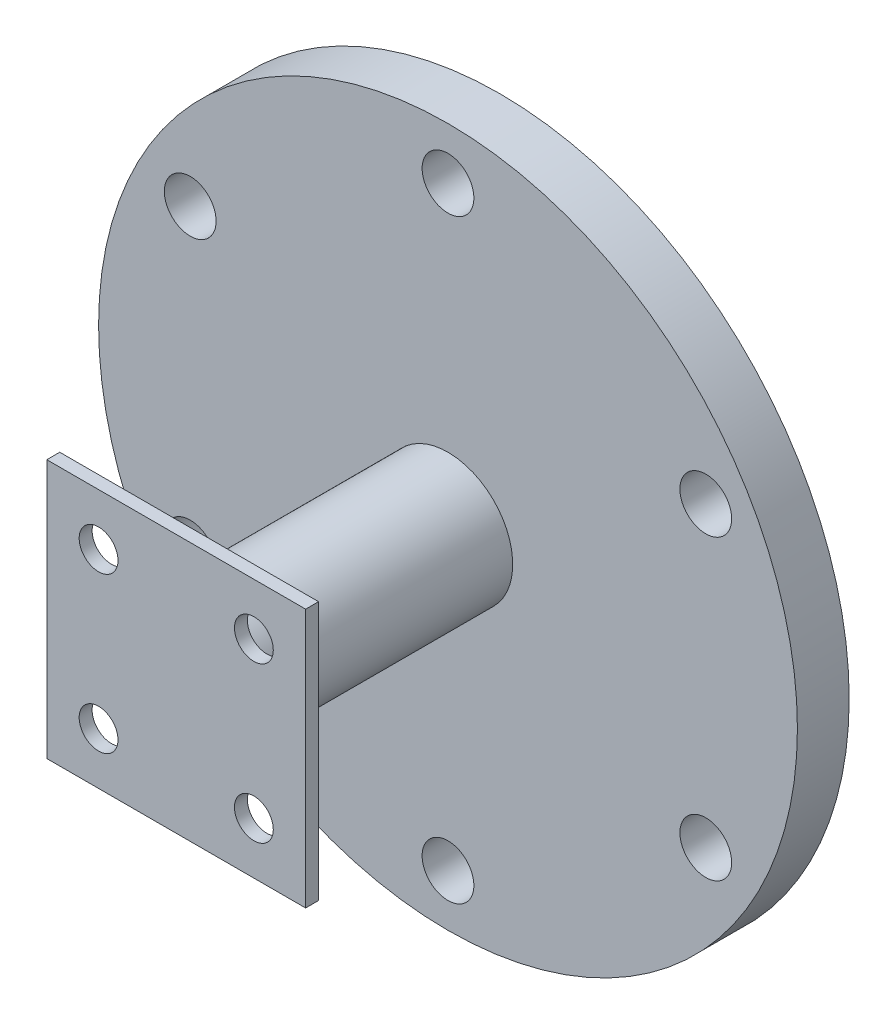
ISO-10303-21;
HEADER;
FILE_DESCRIPTION(('STEP AP214'),'2;1');
FILE_NAME('part.step','',(''),(''),'','','');
FILE_SCHEMA(('AUTOMOTIVE_DESIGN { 1 0 10303 214 1 1 1 1 }'));
ENDSEC;
DATA;
#1=APPLICATION_CONTEXT('core data for automotive mechanical design processes');
#2=APPLICATION_PROTOCOL_DEFINITION('international standard','automotive_design',2000,#1);
#3=PRODUCT_CONTEXT('',#1,'mechanical');
#4=PRODUCT('Part','Part','',(#3));
#5=PRODUCT_RELATED_PRODUCT_CATEGORY('part','',(#4));
#6=PRODUCT_DEFINITION_FORMATION('','',#4);
#7=PRODUCT_DEFINITION_CONTEXT('part definition',#1,'design');
#8=PRODUCT_DEFINITION('design','',#6,#7);
#9=PRODUCT_DEFINITION_SHAPE('','',#8);
#10=(LENGTH_UNIT() NAMED_UNIT(*) SI_UNIT(.MILLI.,.METRE.));
#11=(NAMED_UNIT(*) PLANE_ANGLE_UNIT() SI_UNIT($,.RADIAN.));
#12=(NAMED_UNIT(*) SI_UNIT($,.STERADIAN.) SOLID_ANGLE_UNIT());
#13=UNCERTAINTY_MEASURE_WITH_UNIT(LENGTH_MEASURE(1.E-05),#10,'distance_accuracy_value','');
#14=(GEOMETRIC_REPRESENTATION_CONTEXT(3) GLOBAL_UNCERTAINTY_ASSIGNED_CONTEXT((#13)) GLOBAL_UNIT_ASSIGNED_CONTEXT((#10,
#11,#12)) REPRESENTATION_CONTEXT('',''));
#15=CARTESIAN_POINT('',(0.,0.,0.));
#16=DIRECTION('',(0.,0.,1.));
#17=DIRECTION('',(1.,0.,0.));
#18=AXIS2_PLACEMENT_3D('',#15,#16,#17);
#19=CARTESIAN_POINT('',(0.,0.,0.));
#20=DIRECTION('',(0.,0.,1.));
#21=DIRECTION('',(1.,0.,0.));
#22=AXIS2_PLACEMENT_3D('',#19,#20,#21);
#23=PLANE('',#22);
#24=CARTESIAN_POINT('',(0.,23.,0.));
#25=DIRECTION('',(0.,0.,-1.));
#26=DIRECTION('',(-1.,0.,0.));
#27=AXIS2_PLACEMENT_3D('',#24,#25,#26);
#28=CIRCLE('',#27,2.);
#29=CARTESIAN_POINT('',(2.,23.,0.));
#30=VERTEX_POINT('',#29);
#31=EDGE_CURVE('E282',#30,#30,#28,.T.);
#32=ORIENTED_EDGE('',*,*,#31,.F.);
#33=EDGE_LOOP('',(#32));
#34=FACE_BOUND('',#33,.T.);
#35=CARTESIAN_POINT('',(-19.9185842870421,11.5,0.));
#36=DIRECTION('',(0.,0.,-1.));
#37=DIRECTION('',(-1.,0.,0.));
#38=AXIS2_PLACEMENT_3D('',#35,#36,#37);
#39=CIRCLE('',#38,2.);
#40=CARTESIAN_POINT('',(-17.9185842870421,11.5,0.));
#41=VERTEX_POINT('',#40);
#42=EDGE_CURVE('E223',#41,#41,#39,.T.);
#43=ORIENTED_EDGE('',*,*,#42,.F.);
#44=EDGE_LOOP('',(#43));
#45=FACE_BOUND('',#44,.T.);
#46=CARTESIAN_POINT('',(-19.9185842870421,-11.5,0.));
#47=DIRECTION('',(0.,0.,-1.));
#48=DIRECTION('',(-1.,0.,0.));
#49=AXIS2_PLACEMENT_3D('',#46,#47,#48);
#50=CIRCLE('',#49,2.);
#51=CARTESIAN_POINT('',(-17.9185842870421,-11.5,0.));
#52=VERTEX_POINT('',#51);
#53=EDGE_CURVE('E142',#52,#52,#50,.T.);
#54=ORIENTED_EDGE('',*,*,#53,.F.);
#55=EDGE_LOOP('',(#54));
#56=FACE_BOUND('',#55,.T.);
#57=CARTESIAN_POINT('',(0.,-23.,0.));
#58=DIRECTION('',(0.,0.,-1.));
#59=DIRECTION('',(-1.,0.,0.));
#60=AXIS2_PLACEMENT_3D('',#57,#58,#59);
#61=CIRCLE('',#60,2.);
#62=CARTESIAN_POINT('',(2.,-23.,0.));
#63=VERTEX_POINT('',#62);
#64=EDGE_CURVE('E154',#63,#63,#61,.T.);
#65=ORIENTED_EDGE('',*,*,#64,.F.);
#66=EDGE_LOOP('',(#65));
#67=FACE_BOUND('',#66,.T.);
#68=CARTESIAN_POINT('',(19.9185842870421,-11.5,0.));
#69=DIRECTION('',(0.,0.,-1.));
#70=DIRECTION('',(-1.,0.,0.));
#71=AXIS2_PLACEMENT_3D('',#68,#69,#70);
#72=CIRCLE('',#71,2.);
#73=CARTESIAN_POINT('',(21.9185842870421,-11.5,0.));
#74=VERTEX_POINT('',#73);
#75=EDGE_CURVE('E241',#74,#74,#72,.T.);
#76=ORIENTED_EDGE('',*,*,#75,.F.);
#77=EDGE_LOOP('',(#76));
#78=FACE_BOUND('',#77,.T.);
#79=CARTESIAN_POINT('',(19.9185842870421,11.5,0.));
#80=DIRECTION('',(0.,0.,-1.));
#81=DIRECTION('',(-1.,0.,0.));
#82=AXIS2_PLACEMENT_3D('',#79,#80,#81);
#83=CIRCLE('',#82,2.);
#84=CARTESIAN_POINT('',(21.9185842870421,11.5,0.));
#85=VERTEX_POINT('',#84);
#86=EDGE_CURVE('E172',#85,#85,#83,.T.);
#87=ORIENTED_EDGE('',*,*,#86,.F.);
#88=EDGE_LOOP('',(#87));
#89=FACE_BOUND('',#88,.T.);
#90=CARTESIAN_POINT('',(0.,0.,0.));
#91=DIRECTION('',(0.,0.,1.));
#92=DIRECTION('',(1.,0.,0.));
#93=AXIS2_PLACEMENT_3D('',#90,#91,#92);
#94=CIRCLE('',#93,27.);
#95=CARTESIAN_POINT('',(-27.,0.,0.));
#96=VERTEX_POINT('',#95);
#97=EDGE_CURVE('E11',#96,#96,#94,.T.);
#98=ORIENTED_EDGE('',*,*,#97,.F.);
#99=EDGE_LOOP('',(#98));
#100=FACE_BOUND('',#99,.T.);
#101=ADVANCED_FACE('F16',(#34,#45,#56,#67,#78,#89,#100),#23,.F.);
#102=CARTESIAN_POINT('',(0.,0.,4.));
#103=DIRECTION('',(0.,0.,1.));
#104=DIRECTION('',(1.,0.,0.));
#105=AXIS2_PLACEMENT_3D('',#102,#103,#104);
#106=PLANE('',#105);
#107=CARTESIAN_POINT('',(0.,23.,4.));
#108=DIRECTION('',(0.,0.,-1.));
#109=DIRECTION('',(-1.,0.,0.));
#110=AXIS2_PLACEMENT_3D('',#107,#108,#109);
#111=CIRCLE('',#110,2.);
#112=CARTESIAN_POINT('',(2.,23.,4.));
#113=VERTEX_POINT('',#112);
#114=EDGE_CURVE('E212',#113,#113,#111,.T.);
#115=ORIENTED_EDGE('',*,*,#114,.T.);
#116=EDGE_LOOP('',(#115));
#117=FACE_BOUND('',#116,.T.);
#118=CARTESIAN_POINT('',(-19.9185842870421,11.5,4.));
#119=DIRECTION('',(0.,0.,-1.));
#120=DIRECTION('',(-1.,0.,0.));
#121=AXIS2_PLACEMENT_3D('',#118,#119,#120);
#122=CIRCLE('',#121,2.);
#123=CARTESIAN_POINT('',(-17.9185842870421,11.5,4.));
#124=VERTEX_POINT('',#123);
#125=EDGE_CURVE('E20',#124,#124,#122,.T.);
#126=ORIENTED_EDGE('',*,*,#125,.T.);
#127=EDGE_LOOP('',(#126));
#128=FACE_BOUND('',#127,.T.);
#129=CARTESIAN_POINT('',(-19.9185842870421,-11.5,4.));
#130=DIRECTION('',(0.,0.,-1.));
#131=DIRECTION('',(-1.,0.,0.));
#132=AXIS2_PLACEMENT_3D('',#129,#130,#131);
#133=CIRCLE('',#132,2.);
#134=CARTESIAN_POINT('',(-17.9185842870421,-11.5,4.));
#135=VERTEX_POINT('',#134);
#136=EDGE_CURVE('E264',#135,#135,#133,.T.);
#137=ORIENTED_EDGE('',*,*,#136,.T.);
#138=EDGE_LOOP('',(#137));
#139=FACE_BOUND('',#138,.T.);
#140=CARTESIAN_POINT('',(0.,-23.,4.));
#141=DIRECTION('',(0.,0.,-1.));
#142=DIRECTION('',(-1.,0.,0.));
#143=AXIS2_PLACEMENT_3D('',#140,#141,#142);
#144=CIRCLE('',#143,2.);
#145=CARTESIAN_POINT('',(2.,-23.,4.));
#146=VERTEX_POINT('',#145);
#147=EDGE_CURVE('E152',#146,#146,#144,.T.);
#148=ORIENTED_EDGE('',*,*,#147,.T.);
#149=EDGE_LOOP('',(#148));
#150=FACE_BOUND('',#149,.T.);
#151=CARTESIAN_POINT('',(19.9185842870421,-11.5,4.));
#152=DIRECTION('',(0.,0.,-1.));
#153=DIRECTION('',(-1.,0.,0.));
#154=AXIS2_PLACEMENT_3D('',#151,#152,#153);
#155=CIRCLE('',#154,2.);
#156=CARTESIAN_POINT('',(21.9185842870421,-11.5,4.));
#157=VERTEX_POINT('',#156);
#158=EDGE_CURVE('E177',#157,#157,#155,.T.);
#159=ORIENTED_EDGE('',*,*,#158,.T.);
#160=EDGE_LOOP('',(#159));
#161=FACE_BOUND('',#160,.T.);
#162=CARTESIAN_POINT('',(19.9185842870421,11.5,4.));
#163=DIRECTION('',(0.,0.,-1.));
#164=DIRECTION('',(-1.,0.,0.));
#165=AXIS2_PLACEMENT_3D('',#162,#163,#164);
#166=CIRCLE('',#165,2.);
#167=CARTESIAN_POINT('',(21.9185842870421,11.5,4.));
#168=VERTEX_POINT('',#167);
#169=EDGE_CURVE('E227',#168,#168,#166,.T.);
#170=ORIENTED_EDGE('',*,*,#169,.T.);
#171=EDGE_LOOP('',(#170));
#172=FACE_BOUND('',#171,.T.);
#173=CARTESIAN_POINT('',(0.,0.,4.));
#174=DIRECTION('',(0.,0.,-1.));
#175=DIRECTION('',(1.,0.,0.));
#176=AXIS2_PLACEMENT_3D('',#173,#174,#175);
#177=CIRCLE('',#176,5.);
#178=CARTESIAN_POINT('',(-5.,0.,4.));
#179=VERTEX_POINT('',#178);
#180=EDGE_CURVE('E210',#179,#179,#177,.T.);
#181=ORIENTED_EDGE('',*,*,#180,.T.);
#182=EDGE_LOOP('',(#181));
#183=FACE_BOUND('',#182,.T.);
#184=CARTESIAN_POINT('',(0.,0.,4.));
#185=DIRECTION('',(0.,0.,1.));
#186=DIRECTION('',(1.,0.,0.));
#187=AXIS2_PLACEMENT_3D('',#184,#185,#186);
#188=CIRCLE('',#187,27.);
#189=CARTESIAN_POINT('',(-27.,0.,4.));
#190=VERTEX_POINT('',#189);
#191=EDGE_CURVE('E175',#190,#190,#188,.T.);
#192=ORIENTED_EDGE('',*,*,#191,.T.);
#193=EDGE_LOOP('',(#192));
#194=FACE_BOUND('',#193,.T.);
#195=ADVANCED_FACE('F158',(#117,#128,#139,#150,#161,#172,#183,#194),#106,.T.);
#196=CARTESIAN_POINT('',(0.,0.,0.));
#197=DIRECTION('',(0.,0.,1.));
#198=DIRECTION('',(1.,0.,0.));
#199=AXIS2_PLACEMENT_3D('',#196,#197,#198);
#200=CYLINDRICAL_SURFACE('',#199,27.);
#201=ORIENTED_EDGE('',*,*,#191,.F.);
#202=DIRECTION('',(0.,0.,-1.));
#203=VECTOR('',#202,1.);
#204=CARTESIAN_POINT('',(-27.,0.,0.));
#205=LINE('',#204,#203);
#206=EDGE_CURVE('E27',#190,#96,#205,.T.);
#207=ORIENTED_EDGE('',*,*,#206,.T.);
#208=ORIENTED_EDGE('',*,*,#97,.T.);
#209=ORIENTED_EDGE('',*,*,#206,.F.);
#210=EDGE_LOOP('',(#201,#207,#208,#209));
#211=FACE_BOUND('',#210,.T.);
#212=ADVANCED_FACE('F463',(#211),#200,.T.);
#213=CARTESIAN_POINT('',(19.9185842870421,11.5,0.));
#214=DIRECTION('',(0.,0.,1.));
#215=DIRECTION('',(-1.,0.,0.));
#216=AXIS2_PLACEMENT_3D('',#213,#214,#215);
#217=CYLINDRICAL_SURFACE('',#216,2.);
#218=ORIENTED_EDGE('',*,*,#169,.F.);
#219=DIRECTION('',(0.,0.,-1.));
#220=VECTOR('',#219,1.);
#221=CARTESIAN_POINT('',(21.9185842870421,11.5,0.));
#222=LINE('',#221,#220);
#223=EDGE_CURVE('E176',#168,#85,#222,.T.);
#224=ORIENTED_EDGE('',*,*,#223,.T.);
#225=ORIENTED_EDGE('',*,*,#86,.T.);
#226=ORIENTED_EDGE('',*,*,#223,.F.);
#227=EDGE_LOOP('',(#218,#224,#225,#226));
#228=FACE_BOUND('',#227,.T.);
#229=ADVANCED_FACE('F379',(#228),#217,.F.);
#230=CARTESIAN_POINT('',(19.9185842870421,-11.5,0.));
#231=DIRECTION('',(0.,0.,1.));
#232=DIRECTION('',(-1.,0.,0.));
#233=AXIS2_PLACEMENT_3D('',#230,#231,#232);
#234=CYLINDRICAL_SURFACE('',#233,2.);
#235=ORIENTED_EDGE('',*,*,#158,.F.);
#236=DIRECTION('',(0.,0.,-1.));
#237=VECTOR('',#236,1.);
#238=CARTESIAN_POINT('',(21.9185842870421,-11.5,0.));
#239=LINE('',#238,#237);
#240=EDGE_CURVE('E181',#157,#74,#239,.T.);
#241=ORIENTED_EDGE('',*,*,#240,.T.);
#242=ORIENTED_EDGE('',*,*,#75,.T.);
#243=ORIENTED_EDGE('',*,*,#240,.F.);
#244=EDGE_LOOP('',(#235,#241,#242,#243));
#245=FACE_BOUND('',#244,.T.);
#246=ADVANCED_FACE('F370',(#245),#234,.F.);
#247=CARTESIAN_POINT('',(0.,-23.,0.));
#248=DIRECTION('',(0.,0.,1.));
#249=DIRECTION('',(-1.,0.,0.));
#250=AXIS2_PLACEMENT_3D('',#247,#248,#249);
#251=CYLINDRICAL_SURFACE('',#250,2.);
#252=ORIENTED_EDGE('',*,*,#147,.F.);
#253=DIRECTION('',(0.,0.,-1.));
#254=VECTOR('',#253,1.);
#255=CARTESIAN_POINT('',(2.,-23.,0.));
#256=LINE('',#255,#254);
#257=EDGE_CURVE('E149',#146,#63,#256,.T.);
#258=ORIENTED_EDGE('',*,*,#257,.T.);
#259=ORIENTED_EDGE('',*,*,#64,.T.);
#260=ORIENTED_EDGE('',*,*,#257,.F.);
#261=EDGE_LOOP('',(#252,#258,#259,#260));
#262=FACE_BOUND('',#261,.T.);
#263=ADVANCED_FACE('F151',(#262),#251,.F.);
#264=CARTESIAN_POINT('',(-19.9185842870421,-11.5,0.));
#265=DIRECTION('',(0.,0.,1.));
#266=DIRECTION('',(-1.,0.,0.));
#267=AXIS2_PLACEMENT_3D('',#264,#265,#266);
#268=CYLINDRICAL_SURFACE('',#267,2.);
#269=ORIENTED_EDGE('',*,*,#136,.F.);
#270=DIRECTION('',(0.,0.,-1.));
#271=VECTOR('',#270,1.);
#272=CARTESIAN_POINT('',(-17.9185842870421,-11.5,0.));
#273=LINE('',#272,#271);
#274=EDGE_CURVE('E166',#135,#52,#273,.T.);
#275=ORIENTED_EDGE('',*,*,#274,.T.);
#276=ORIENTED_EDGE('',*,*,#53,.T.);
#277=ORIENTED_EDGE('',*,*,#274,.F.);
#278=EDGE_LOOP('',(#269,#275,#276,#277));
#279=FACE_BOUND('',#278,.T.);
#280=ADVANCED_FACE('F369',(#279),#268,.F.);
#281=CARTESIAN_POINT('',(-19.9185842870421,11.5,0.));
#282=DIRECTION('',(0.,0.,1.));
#283=DIRECTION('',(-1.,0.,0.));
#284=AXIS2_PLACEMENT_3D('',#281,#282,#283);
#285=CYLINDRICAL_SURFACE('',#284,2.);
#286=ORIENTED_EDGE('',*,*,#125,.F.);
#287=DIRECTION('',(0.,0.,-1.));
#288=VECTOR('',#287,1.);
#289=CARTESIAN_POINT('',(-17.9185842870421,11.5,0.));
#290=LINE('',#289,#288);
#291=EDGE_CURVE('E219',#124,#41,#290,.T.);
#292=ORIENTED_EDGE('',*,*,#291,.T.);
#293=ORIENTED_EDGE('',*,*,#42,.T.);
#294=ORIENTED_EDGE('',*,*,#291,.F.);
#295=EDGE_LOOP('',(#286,#292,#293,#294));
#296=FACE_BOUND('',#295,.T.);
#297=ADVANCED_FACE('F422',(#296),#285,.F.);
#298=CARTESIAN_POINT('',(0.,23.,0.));
#299=DIRECTION('',(0.,0.,1.));
#300=DIRECTION('',(-1.,0.,0.));
#301=AXIS2_PLACEMENT_3D('',#298,#299,#300);
#302=CYLINDRICAL_SURFACE('',#301,2.);
#303=ORIENTED_EDGE('',*,*,#114,.F.);
#304=DIRECTION('',(0.,0.,-1.));
#305=VECTOR('',#304,1.);
#306=CARTESIAN_POINT('',(2.,23.,0.));
#307=LINE('',#306,#305);
#308=EDGE_CURVE('E216',#113,#30,#307,.T.);
#309=ORIENTED_EDGE('',*,*,#308,.T.);
#310=ORIENTED_EDGE('',*,*,#31,.T.);
#311=ORIENTED_EDGE('',*,*,#308,.F.);
#312=EDGE_LOOP('',(#303,#309,#310,#311));
#313=FACE_BOUND('',#312,.T.);
#314=ADVANCED_FACE('F417',(#313),#302,.F.);
#315=CARTESIAN_POINT('',(0.,0.,4.));
#316=DIRECTION('',(0.,0.,1.));
#317=DIRECTION('',(1.,0.,0.));
#318=AXIS2_PLACEMENT_3D('',#315,#316,#317);
#319=CYLINDRICAL_SURFACE('',#318,5.);
#320=CARTESIAN_POINT('',(0.,0.,24.));
#321=DIRECTION('',(0.,0.,1.));
#322=DIRECTION('',(1.,0.,0.));
#323=AXIS2_PLACEMENT_3D('',#320,#321,#322);
#324=CIRCLE('',#323,5.);
#325=CARTESIAN_POINT('',(-5.,0.,24.));
#326=VERTEX_POINT('',#325);
#327=EDGE_CURVE('E228',#326,#326,#324,.T.);
#328=ORIENTED_EDGE('',*,*,#327,.F.);
#329=DIRECTION('',(0.,0.,-1.));
#330=VECTOR('',#329,1.);
#331=CARTESIAN_POINT('',(-5.,0.,4.));
#332=LINE('',#331,#330);
#333=EDGE_CURVE('E206',#326,#179,#332,.T.);
#334=ORIENTED_EDGE('',*,*,#333,.T.);
#335=ORIENTED_EDGE('',*,*,#180,.F.);
#336=ORIENTED_EDGE('',*,*,#333,.F.);
#337=EDGE_LOOP('',(#328,#334,#335,#336));
#338=FACE_BOUND('',#337,.T.);
#339=ADVANCED_FACE('F319',(#338),#319,.T.);
#340=CARTESIAN_POINT('',(0.,0.,25.));
#341=DIRECTION('',(0.,0.,1.));
#342=DIRECTION('',(1.,0.,0.));
#343=AXIS2_PLACEMENT_3D('',#340,#341,#342);
#344=PLANE('',#343);
#345=CARTESIAN_POINT('',(6.,6.,25.));
#346=DIRECTION('',(0.,0.,-1.));
#347=DIRECTION('',(-1.,0.,0.));
#348=AXIS2_PLACEMENT_3D('',#345,#346,#347);
#349=CIRCLE('',#348,1.5);
#350=CARTESIAN_POINT('',(7.5,6.,25.));
#351=VERTEX_POINT('',#350);
#352=EDGE_CURVE('E232',#351,#351,#349,.T.);
#353=ORIENTED_EDGE('',*,*,#352,.T.);
#354=EDGE_LOOP('',(#353));
#355=FACE_BOUND('',#354,.T.);
#356=CARTESIAN_POINT('',(-6.,6.,25.));
#357=DIRECTION('',(0.,0.,-1.));
#358=DIRECTION('',(-1.,0.,0.));
#359=AXIS2_PLACEMENT_3D('',#356,#357,#358);
#360=CIRCLE('',#359,1.5);
#361=CARTESIAN_POINT('',(-4.5,6.,25.));
#362=VERTEX_POINT('',#361);
#363=EDGE_CURVE('E233',#362,#362,#360,.T.);
#364=ORIENTED_EDGE('',*,*,#363,.T.);
#365=EDGE_LOOP('',(#364));
#366=FACE_BOUND('',#365,.T.);
#367=CARTESIAN_POINT('',(-6.,-6.,25.));
#368=DIRECTION('',(0.,0.,-1.));
#369=DIRECTION('',(-1.,0.,0.));
#370=AXIS2_PLACEMENT_3D('',#367,#368,#369);
#371=CIRCLE('',#370,1.5);
#372=CARTESIAN_POINT('',(-4.5,-6.,25.));
#373=VERTEX_POINT('',#372);
#374=EDGE_CURVE('E187',#373,#373,#371,.T.);
#375=ORIENTED_EDGE('',*,*,#374,.T.);
#376=EDGE_LOOP('',(#375));
#377=FACE_BOUND('',#376,.T.);
#378=CARTESIAN_POINT('',(6.,-6.,25.));
#379=DIRECTION('',(0.,0.,-1.));
#380=DIRECTION('',(-1.,0.,0.));
#381=AXIS2_PLACEMENT_3D('',#378,#379,#380);
#382=CIRCLE('',#381,1.5);
#383=CARTESIAN_POINT('',(7.5,-6.,25.));
#384=VERTEX_POINT('',#383);
#385=EDGE_CURVE('E253',#384,#384,#382,.T.);
#386=ORIENTED_EDGE('',*,*,#385,.T.);
#387=EDGE_LOOP('',(#386));
#388=FACE_BOUND('',#387,.T.);
#389=DIRECTION('',(-1.,0.,0.));
#390=VECTOR('',#389,1.);
#391=CARTESIAN_POINT('',(10.,10.,25.));
#392=LINE('',#391,#390);
#393=CARTESIAN_POINT('',(10.,10.,25.));
#394=VERTEX_POINT('',#393);
#395=CARTESIAN_POINT('',(-10.,10.,25.));
#396=VERTEX_POINT('',#395);
#397=EDGE_CURVE('E211',#394,#396,#392,.T.);
#398=ORIENTED_EDGE('',*,*,#397,.T.);
#399=DIRECTION('',(0.,-1.,0.));
#400=VECTOR('',#399,1.);
#401=CARTESIAN_POINT('',(-10.,10.,25.));
#402=LINE('',#401,#400);
#403=CARTESIAN_POINT('',(-10.,-10.,25.));
#404=VERTEX_POINT('',#403);
#405=EDGE_CURVE('E170',#396,#404,#402,.T.);
#406=ORIENTED_EDGE('',*,*,#405,.T.);
#407=DIRECTION('',(1.,0.,0.));
#408=VECTOR('',#407,1.);
#409=CARTESIAN_POINT('',(-10.,-10.,25.));
#410=LINE('',#409,#408);
#411=CARTESIAN_POINT('',(10.,-10.,25.));
#412=VERTEX_POINT('',#411);
#413=EDGE_CURVE('E182',#404,#412,#410,.T.);
#414=ORIENTED_EDGE('',*,*,#413,.T.);
#415=DIRECTION('',(0.,1.,0.));
#416=VECTOR('',#415,1.);
#417=CARTESIAN_POINT('',(10.,-10.,25.));
#418=LINE('',#417,#416);
#419=EDGE_CURVE('E304',#412,#394,#418,.T.);
#420=ORIENTED_EDGE('',*,*,#419,.T.);
#421=EDGE_LOOP('',(#398,#406,#414,#420));
#422=FACE_BOUND('',#421,.T.);
#423=ADVANCED_FACE('F315',(#355,#366,#377,#388,#422),#344,.T.);
#424=CARTESIAN_POINT('',(10.,10.,24.));
#425=DIRECTION('',(0.,1.,0.));
#426=DIRECTION('',(1.,0.,0.));
#427=AXIS2_PLACEMENT_3D('',#424,#425,#426);
#428=PLANE('',#427);
#429=DIRECTION('',(-1.,0.,0.));
#430=VECTOR('',#429,1.);
#431=CARTESIAN_POINT('',(10.,10.,24.));
#432=LINE('',#431,#430);
#433=CARTESIAN_POINT('',(10.,10.,24.));
#434=VERTEX_POINT('',#433);
#435=CARTESIAN_POINT('',(-10.,10.,24.));
#436=VERTEX_POINT('',#435);
#437=EDGE_CURVE('E193',#434,#436,#432,.T.);
#438=ORIENTED_EDGE('',*,*,#437,.T.);
#439=DIRECTION('',(0.,0.,1.));
#440=VECTOR('',#439,1.);
#441=CARTESIAN_POINT('',(-10.,10.,24.));
#442=LINE('',#441,#440);
#443=EDGE_CURVE('E296',#436,#396,#442,.T.);
#444=ORIENTED_EDGE('',*,*,#443,.T.);
#445=ORIENTED_EDGE('',*,*,#397,.F.);
#446=DIRECTION('',(0.,0.,1.));
#447=VECTOR('',#446,1.);
#448=CARTESIAN_POINT('',(10.,10.,24.));
#449=LINE('',#448,#447);
#450=EDGE_CURVE('E300',#434,#394,#449,.T.);
#451=ORIENTED_EDGE('',*,*,#450,.F.);
#452=EDGE_LOOP('',(#438,#444,#445,#451));
#453=FACE_BOUND('',#452,.T.);
#454=ADVANCED_FACE('F318',(#453),#428,.T.);
#455=CARTESIAN_POINT('',(-10.,10.,24.));
#456=DIRECTION('',(-1.,0.,0.));
#457=DIRECTION('',(0.,1.,0.));
#458=AXIS2_PLACEMENT_3D('',#455,#456,#457);
#459=PLANE('',#458);
#460=DIRECTION('',(0.,-1.,0.));
#461=VECTOR('',#460,1.);
#462=CARTESIAN_POINT('',(-10.,10.,24.));
#463=LINE('',#462,#461);
#464=CARTESIAN_POINT('',(-10.,-10.,24.));
#465=VERTEX_POINT('',#464);
#466=EDGE_CURVE('E248',#436,#465,#463,.T.);
#467=ORIENTED_EDGE('',*,*,#466,.T.);
#468=DIRECTION('',(0.,0.,1.));
#469=VECTOR('',#468,1.);
#470=CARTESIAN_POINT('',(-10.,-10.,24.));
#471=LINE('',#470,#469);
#472=EDGE_CURVE('E185',#465,#404,#471,.T.);
#473=ORIENTED_EDGE('',*,*,#472,.T.);
#474=ORIENTED_EDGE('',*,*,#405,.F.);
#475=ORIENTED_EDGE('',*,*,#443,.F.);
#476=EDGE_LOOP('',(#467,#473,#474,#475));
#477=FACE_BOUND('',#476,.T.);
#478=ADVANCED_FACE('F332',(#477),#459,.T.);
#479=CARTESIAN_POINT('',(-10.,-10.,24.));
#480=DIRECTION('',(0.,-1.,0.));
#481=DIRECTION('',(0.,0.,-1.));
#482=AXIS2_PLACEMENT_3D('',#479,#480,#481);
#483=PLANE('',#482);
#484=DIRECTION('',(1.,0.,0.));
#485=VECTOR('',#484,1.);
#486=CARTESIAN_POINT('',(-10.,-10.,24.));
#487=LINE('',#486,#485);
#488=CARTESIAN_POINT('',(10.,-10.,24.));
#489=VERTEX_POINT('',#488);
#490=EDGE_CURVE('E245',#465,#489,#487,.T.);
#491=ORIENTED_EDGE('',*,*,#490,.T.);
#492=DIRECTION('',(0.,0.,1.));
#493=VECTOR('',#492,1.);
#494=CARTESIAN_POINT('',(10.,-10.,24.));
#495=LINE('',#494,#493);
#496=EDGE_CURVE('E186',#489,#412,#495,.T.);
#497=ORIENTED_EDGE('',*,*,#496,.T.);
#498=ORIENTED_EDGE('',*,*,#413,.F.);
#499=ORIENTED_EDGE('',*,*,#472,.F.);
#500=EDGE_LOOP('',(#491,#497,#498,#499));
#501=FACE_BOUND('',#500,.T.);
#502=ADVANCED_FACE('F402',(#501),#483,.T.);
#503=CARTESIAN_POINT('',(10.,-10.,24.));
#504=DIRECTION('',(1.,0.,0.));
#505=DIRECTION('',(0.,1.,0.));
#506=AXIS2_PLACEMENT_3D('',#503,#504,#505);
#507=PLANE('',#506);
#508=DIRECTION('',(0.,1.,0.));
#509=VECTOR('',#508,1.);
#510=CARTESIAN_POINT('',(10.,-10.,24.));
#511=LINE('',#510,#509);
#512=EDGE_CURVE('E197',#489,#434,#511,.T.);
#513=ORIENTED_EDGE('',*,*,#512,.T.);
#514=ORIENTED_EDGE('',*,*,#450,.T.);
#515=ORIENTED_EDGE('',*,*,#419,.F.);
#516=ORIENTED_EDGE('',*,*,#496,.F.);
#517=EDGE_LOOP('',(#513,#514,#515,#516));
#518=FACE_BOUND('',#517,.T.);
#519=ADVANCED_FACE('F397',(#518),#507,.T.);
#520=CARTESIAN_POINT('',(6.,-6.,24.));
#521=DIRECTION('',(0.,0.,1.));
#522=DIRECTION('',(-1.,0.,0.));
#523=AXIS2_PLACEMENT_3D('',#520,#521,#522);
#524=CYLINDRICAL_SURFACE('',#523,1.5);
#525=ORIENTED_EDGE('',*,*,#385,.F.);
#526=DIRECTION('',(0.,0.,-1.));
#527=VECTOR('',#526,1.);
#528=CARTESIAN_POINT('',(7.5,-6.,24.));
#529=LINE('',#528,#527);
#530=CARTESIAN_POINT('',(7.5,-6.,24.));
#531=VERTEX_POINT('',#530);
#532=EDGE_CURVE('E257',#384,#531,#529,.T.);
#533=ORIENTED_EDGE('',*,*,#532,.T.);
#534=CARTESIAN_POINT('',(6.,-6.,24.));
#535=DIRECTION('',(0.,0.,-1.));
#536=DIRECTION('',(-1.,0.,0.));
#537=AXIS2_PLACEMENT_3D('',#534,#535,#536);
#538=CIRCLE('',#537,1.5);
#539=EDGE_CURVE('E204',#531,#531,#538,.T.);
#540=ORIENTED_EDGE('',*,*,#539,.T.);
#541=ORIENTED_EDGE('',*,*,#532,.F.);
#542=EDGE_LOOP('',(#525,#533,#540,#541));
#543=FACE_BOUND('',#542,.T.);
#544=ADVANCED_FACE('F18',(#543),#524,.F.);
#545=CARTESIAN_POINT('',(-6.,-6.,24.));
#546=DIRECTION('',(0.,0.,1.));
#547=DIRECTION('',(-1.,0.,0.));
#548=AXIS2_PLACEMENT_3D('',#545,#546,#547);
#549=CYLINDRICAL_SURFACE('',#548,1.5);
#550=ORIENTED_EDGE('',*,*,#374,.F.);
#551=DIRECTION('',(0.,0.,-1.));
#552=VECTOR('',#551,1.);
#553=CARTESIAN_POINT('',(-4.5,-6.,24.));
#554=LINE('',#553,#552);
#555=CARTESIAN_POINT('',(-4.5,-6.,24.));
#556=VERTEX_POINT('',#555);
#557=EDGE_CURVE('E191',#373,#556,#554,.T.);
#558=ORIENTED_EDGE('',*,*,#557,.T.);
#559=CARTESIAN_POINT('',(-6.,-6.,24.));
#560=DIRECTION('',(0.,0.,-1.));
#561=DIRECTION('',(-1.,0.,0.));
#562=AXIS2_PLACEMENT_3D('',#559,#560,#561);
#563=CIRCLE('',#562,1.5);
#564=EDGE_CURVE('E200',#556,#556,#563,.T.);
#565=ORIENTED_EDGE('',*,*,#564,.T.);
#566=ORIENTED_EDGE('',*,*,#557,.F.);
#567=EDGE_LOOP('',(#550,#558,#565,#566));
#568=FACE_BOUND('',#567,.T.);
#569=ADVANCED_FACE('F385',(#568),#549,.F.);
#570=CARTESIAN_POINT('',(-6.,6.,24.));
#571=DIRECTION('',(0.,0.,1.));
#572=DIRECTION('',(-1.,0.,0.));
#573=AXIS2_PLACEMENT_3D('',#570,#571,#572);
#574=CYLINDRICAL_SURFACE('',#573,1.5);
#575=ORIENTED_EDGE('',*,*,#363,.F.);
#576=DIRECTION('',(0.,0.,-1.));
#577=VECTOR('',#576,1.);
#578=CARTESIAN_POINT('',(-4.5,6.,24.));
#579=LINE('',#578,#577);
#580=CARTESIAN_POINT('',(-4.5,6.,24.));
#581=VERTEX_POINT('',#580);
#582=EDGE_CURVE('E192',#362,#581,#579,.T.);
#583=ORIENTED_EDGE('',*,*,#582,.T.);
#584=CARTESIAN_POINT('',(-6.,6.,24.));
#585=DIRECTION('',(0.,0.,-1.));
#586=DIRECTION('',(-1.,0.,0.));
#587=AXIS2_PLACEMENT_3D('',#584,#585,#586);
#588=CIRCLE('',#587,1.5);
#589=EDGE_CURVE('E205',#581,#581,#588,.T.);
#590=ORIENTED_EDGE('',*,*,#589,.T.);
#591=ORIENTED_EDGE('',*,*,#582,.F.);
#592=EDGE_LOOP('',(#575,#583,#590,#591));
#593=FACE_BOUND('',#592,.T.);
#594=ADVANCED_FACE('F390',(#593),#574,.F.);
#595=CARTESIAN_POINT('',(6.,6.,24.));
#596=DIRECTION('',(0.,0.,1.));
#597=DIRECTION('',(-1.,0.,0.));
#598=AXIS2_PLACEMENT_3D('',#595,#596,#597);
#599=CYLINDRICAL_SURFACE('',#598,1.5);
#600=ORIENTED_EDGE('',*,*,#352,.F.);
#601=DIRECTION('',(0.,0.,-1.));
#602=VECTOR('',#601,1.);
#603=CARTESIAN_POINT('',(7.5,6.,24.));
#604=LINE('',#603,#602);
#605=CARTESIAN_POINT('',(7.5,6.,24.));
#606=VERTEX_POINT('',#605);
#607=EDGE_CURVE('E237',#351,#606,#604,.T.);
#608=ORIENTED_EDGE('',*,*,#607,.T.);
#609=CARTESIAN_POINT('',(6.,6.,24.));
#610=DIRECTION('',(0.,0.,-1.));
#611=DIRECTION('',(-1.,0.,0.));
#612=AXIS2_PLACEMENT_3D('',#609,#610,#611);
#613=CIRCLE('',#612,1.5);
#614=EDGE_CURVE('E258',#606,#606,#613,.T.);
#615=ORIENTED_EDGE('',*,*,#614,.T.);
#616=ORIENTED_EDGE('',*,*,#607,.F.);
#617=EDGE_LOOP('',(#600,#608,#615,#616));
#618=FACE_BOUND('',#617,.T.);
#619=ADVANCED_FACE('F449',(#618),#599,.F.);
#620=CARTESIAN_POINT('',(0.,0.,24.));
#621=DIRECTION('',(0.,0.,1.));
#622=DIRECTION('',(1.,0.,0.));
#623=AXIS2_PLACEMENT_3D('',#620,#621,#622);
#624=PLANE('',#623);
#625=ORIENTED_EDGE('',*,*,#327,.T.);
#626=EDGE_LOOP('',(#625));
#627=FACE_BOUND('',#626,.T.);
#628=ORIENTED_EDGE('',*,*,#539,.F.);
#629=EDGE_LOOP('',(#628));
#630=FACE_BOUND('',#629,.T.);
#631=ORIENTED_EDGE('',*,*,#564,.F.);
#632=EDGE_LOOP('',(#631));
#633=FACE_BOUND('',#632,.T.);
#634=ORIENTED_EDGE('',*,*,#589,.F.);
#635=EDGE_LOOP('',(#634));
#636=FACE_BOUND('',#635,.T.);
#637=ORIENTED_EDGE('',*,*,#614,.F.);
#638=EDGE_LOOP('',(#637));
#639=FACE_BOUND('',#638,.T.);
#640=ORIENTED_EDGE('',*,*,#437,.F.);
#641=ORIENTED_EDGE('',*,*,#512,.F.);
#642=ORIENTED_EDGE('',*,*,#490,.F.);
#643=ORIENTED_EDGE('',*,*,#466,.F.);
#644=EDGE_LOOP('',(#640,#641,#642,#643));
#645=FACE_BOUND('',#644,.T.);
#646=ADVANCED_FACE('F454',(#627,#630,#633,#636,#639,#645),#624,.F.);
#647=CLOSED_SHELL('',(#101,#195,#212,#229,#246,#263,#280,#297,#314,#339,#423,#454,#478,#502,
#519,#544,#569,#594,#619,#646));
#648=MANIFOLD_SOLID_BREP('B1',#647);
#649=ADVANCED_BREP_SHAPE_REPRESENTATION('',(#18,#648),#14);
#650=SHAPE_DEFINITION_REPRESENTATION(#9,#649);
ENDSEC;
END-ISO-10303-21;
